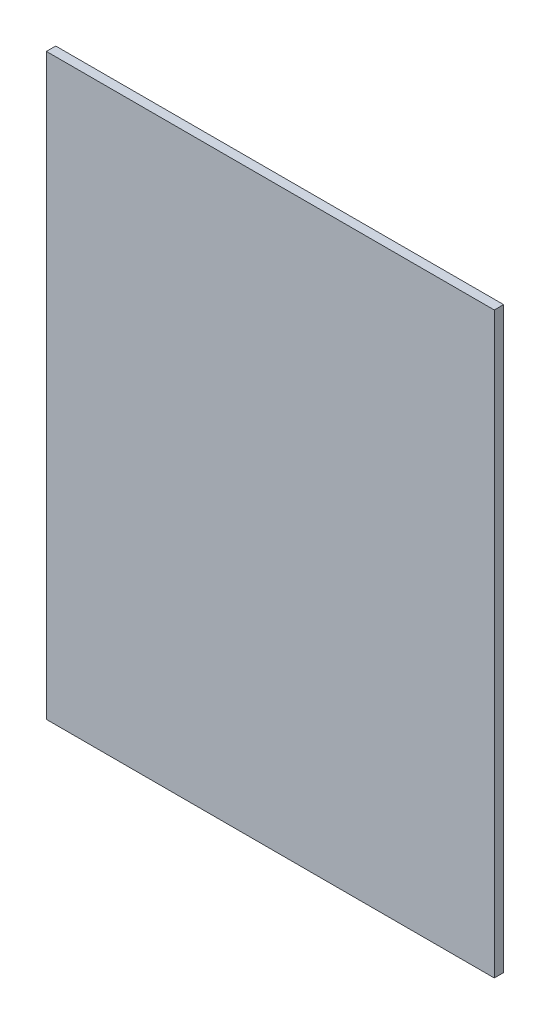
ISO-10303-21;
HEADER;
FILE_DESCRIPTION(('STEP AP214'),'2;1');
FILE_NAME('part.step','',(''),(''),'','','');
FILE_SCHEMA(('AUTOMOTIVE_DESIGN { 1 0 10303 214 1 1 1 1 }'));
ENDSEC;
DATA;
#1=APPLICATION_CONTEXT('core data for automotive mechanical design processes');
#2=APPLICATION_PROTOCOL_DEFINITION('international standard','automotive_design',2000,#1);
#3=PRODUCT_CONTEXT('',#1,'mechanical');
#4=PRODUCT('Part','Part','',(#3));
#5=PRODUCT_RELATED_PRODUCT_CATEGORY('part','',(#4));
#6=PRODUCT_DEFINITION_FORMATION('','',#4);
#7=PRODUCT_DEFINITION_CONTEXT('part definition',#1,'design');
#8=PRODUCT_DEFINITION('design','',#6,#7);
#9=PRODUCT_DEFINITION_SHAPE('','',#8);
#10=(LENGTH_UNIT() NAMED_UNIT(*) SI_UNIT(.MILLI.,.METRE.));
#11=(NAMED_UNIT(*) PLANE_ANGLE_UNIT() SI_UNIT($,.RADIAN.));
#12=(NAMED_UNIT(*) SI_UNIT($,.STERADIAN.) SOLID_ANGLE_UNIT());
#13=UNCERTAINTY_MEASURE_WITH_UNIT(LENGTH_MEASURE(1.E-05),#10,'distance_accuracy_value','');
#14=(GEOMETRIC_REPRESENTATION_CONTEXT(3) GLOBAL_UNCERTAINTY_ASSIGNED_CONTEXT((#13)) GLOBAL_UNIT_ASSIGNED_CONTEXT((#10,
#11,#12)) REPRESENTATION_CONTEXT('',''));
#15=CARTESIAN_POINT('',(0.,0.,0.));
#16=DIRECTION('',(0.,0.,1.));
#17=DIRECTION('',(1.,0.,0.));
#18=AXIS2_PLACEMENT_3D('',#15,#16,#17);
#19=CARTESIAN_POINT('',(120.,-155.,5.));
#20=DIRECTION('',(-1.,0.,0.));
#21=DIRECTION('',(0.,0.,1.));
#22=AXIS2_PLACEMENT_3D('',#19,#20,#21);
#23=PLANE('',#22);
#24=DIRECTION('',(0.,1.,0.));
#25=VECTOR('',#24,1.);
#26=CARTESIAN_POINT('',(120.,-155.,0.));
#27=LINE('',#26,#25);
#28=CARTESIAN_POINT('',(120.,-155.,0.));
#29=VERTEX_POINT('',#28);
#30=CARTESIAN_POINT('',(120.,155.,0.));
#31=VERTEX_POINT('',#30);
#32=EDGE_CURVE('E96',#29,#31,#27,.T.);
#33=ORIENTED_EDGE('',*,*,#32,.T.);
#34=DIRECTION('',(0.,0.,-1.));
#35=VECTOR('',#34,1.);
#36=CARTESIAN_POINT('',(120.,155.,5.));
#37=LINE('',#36,#35);
#38=CARTESIAN_POINT('',(120.,155.,5.));
#39=VERTEX_POINT('',#38);
#40=EDGE_CURVE('E11',#39,#31,#37,.T.);
#41=ORIENTED_EDGE('',*,*,#40,.F.);
#42=DIRECTION('',(0.,1.,0.));
#43=VECTOR('',#42,1.);
#44=CARTESIAN_POINT('',(120.,-155.,5.));
#45=LINE('',#44,#43);
#46=CARTESIAN_POINT('',(120.,-155.,5.));
#47=VERTEX_POINT('',#46);
#48=EDGE_CURVE('E84',#47,#39,#45,.T.);
#49=ORIENTED_EDGE('',*,*,#48,.F.);
#50=DIRECTION('',(0.,0.,-1.));
#51=VECTOR('',#50,1.);
#52=CARTESIAN_POINT('',(120.,-155.,5.));
#53=LINE('',#52,#51);
#54=EDGE_CURVE('E92',#47,#29,#53,.T.);
#55=ORIENTED_EDGE('',*,*,#54,.T.);
#56=EDGE_LOOP('',(#33,#41,#49,#55));
#57=FACE_BOUND('',#56,.T.);
#58=ADVANCED_FACE('F33',(#57),#23,.F.);
#59=CARTESIAN_POINT('',(-120.,155.,5.));
#60=DIRECTION('',(0.,-1.,0.));
#61=DIRECTION('',(0.,0.,-1.));
#62=AXIS2_PLACEMENT_3D('',#59,#60,#61);
#63=PLANE('',#62);
#64=DIRECTION('',(-1.,0.,0.));
#65=VECTOR('',#64,1.);
#66=CARTESIAN_POINT('',(-120.,155.,0.));
#67=LINE('',#66,#65);
#68=CARTESIAN_POINT('',(-120.,155.,0.));
#69=VERTEX_POINT('',#68);
#70=EDGE_CURVE('E88',#31,#69,#67,.T.);
#71=ORIENTED_EDGE('',*,*,#70,.T.);
#72=DIRECTION('',(0.,0.,-1.));
#73=VECTOR('',#72,1.);
#74=CARTESIAN_POINT('',(-120.,155.,5.));
#75=LINE('',#74,#73);
#76=CARTESIAN_POINT('',(-120.,155.,5.));
#77=VERTEX_POINT('',#76);
#78=EDGE_CURVE('E41',#77,#69,#75,.T.);
#79=ORIENTED_EDGE('',*,*,#78,.F.);
#80=DIRECTION('',(-1.,0.,0.));
#81=VECTOR('',#80,1.);
#82=CARTESIAN_POINT('',(-120.,155.,5.));
#83=LINE('',#82,#81);
#84=EDGE_CURVE('E79',#39,#77,#83,.T.);
#85=ORIENTED_EDGE('',*,*,#84,.F.);
#86=ORIENTED_EDGE('',*,*,#40,.T.);
#87=EDGE_LOOP('',(#71,#79,#85,#86));
#88=FACE_BOUND('',#87,.T.);
#89=ADVANCED_FACE('F87',(#88),#63,.F.);
#90=CARTESIAN_POINT('',(-120.,-155.,5.));
#91=DIRECTION('',(1.,0.,0.));
#92=DIRECTION('',(0.,0.,-1.));
#93=AXIS2_PLACEMENT_3D('',#90,#91,#92);
#94=PLANE('',#93);
#95=DIRECTION('',(0.,-1.,0.));
#96=VECTOR('',#95,1.);
#97=CARTESIAN_POINT('',(-120.,-155.,0.));
#98=LINE('',#97,#96);
#99=CARTESIAN_POINT('',(-120.,-155.,0.));
#100=VERTEX_POINT('',#99);
#101=EDGE_CURVE('E66',#69,#100,#98,.T.);
#102=ORIENTED_EDGE('',*,*,#101,.T.);
#103=DIRECTION('',(0.,0.,-1.));
#104=VECTOR('',#103,1.);
#105=CARTESIAN_POINT('',(-120.,-155.,5.));
#106=LINE('',#105,#104);
#107=CARTESIAN_POINT('',(-120.,-155.,5.));
#108=VERTEX_POINT('',#107);
#109=EDGE_CURVE('E89',#108,#100,#106,.T.);
#110=ORIENTED_EDGE('',*,*,#109,.F.);
#111=DIRECTION('',(0.,-1.,0.));
#112=VECTOR('',#111,1.);
#113=CARTESIAN_POINT('',(-120.,-155.,5.));
#114=LINE('',#113,#112);
#115=EDGE_CURVE('E82',#77,#108,#114,.T.);
#116=ORIENTED_EDGE('',*,*,#115,.F.);
#117=ORIENTED_EDGE('',*,*,#78,.T.);
#118=EDGE_LOOP('',(#102,#110,#116,#117));
#119=FACE_BOUND('',#118,.T.);
#120=ADVANCED_FACE('F90',(#119),#94,.F.);
#121=CARTESIAN_POINT('',(-120.,-155.,5.));
#122=DIRECTION('',(0.,1.,0.));
#123=DIRECTION('',(0.,0.,1.));
#124=AXIS2_PLACEMENT_3D('',#121,#122,#123);
#125=PLANE('',#124);
#126=DIRECTION('',(1.,0.,0.));
#127=VECTOR('',#126,1.);
#128=CARTESIAN_POINT('',(-120.,-155.,0.));
#129=LINE('',#128,#127);
#130=EDGE_CURVE('E72',#100,#29,#129,.T.);
#131=ORIENTED_EDGE('',*,*,#130,.T.);
#132=ORIENTED_EDGE('',*,*,#54,.F.);
#133=DIRECTION('',(1.,0.,0.));
#134=VECTOR('',#133,1.);
#135=CARTESIAN_POINT('',(-120.,-155.,5.));
#136=LINE('',#135,#134);
#137=EDGE_CURVE('E49',#108,#47,#136,.T.);
#138=ORIENTED_EDGE('',*,*,#137,.F.);
#139=ORIENTED_EDGE('',*,*,#109,.T.);
#140=EDGE_LOOP('',(#131,#132,#138,#139));
#141=FACE_BOUND('',#140,.T.);
#142=ADVANCED_FACE('F103',(#141),#125,.F.);
#143=CARTESIAN_POINT('',(0.,0.,5.));
#144=DIRECTION('',(0.,0.,-1.));
#145=DIRECTION('',(-1.,0.,0.));
#146=AXIS2_PLACEMENT_3D('',#143,#144,#145);
#147=PLANE('',#146);
#148=ORIENTED_EDGE('',*,*,#48,.T.);
#149=ORIENTED_EDGE('',*,*,#84,.T.);
#150=ORIENTED_EDGE('',*,*,#115,.T.);
#151=ORIENTED_EDGE('',*,*,#137,.T.);
#152=EDGE_LOOP('',(#148,#149,#150,#151));
#153=FACE_BOUND('',#152,.T.);
#154=ADVANCED_FACE('F80',(#153),#147,.F.);
#155=CARTESIAN_POINT('',(0.,0.,0.));
#156=DIRECTION('',(0.,0.,-1.));
#157=DIRECTION('',(-1.,0.,0.));
#158=AXIS2_PLACEMENT_3D('',#155,#156,#157);
#159=PLANE('',#158);
#160=ORIENTED_EDGE('',*,*,#32,.F.);
#161=ORIENTED_EDGE('',*,*,#130,.F.);
#162=ORIENTED_EDGE('',*,*,#101,.F.);
#163=ORIENTED_EDGE('',*,*,#70,.F.);
#164=EDGE_LOOP('',(#160,#161,#162,#163));
#165=FACE_BOUND('',#164,.T.);
#166=ADVANCED_FACE('F106',(#165),#159,.T.);
#167=CLOSED_SHELL('',(#58,#89,#120,#142,#154,#166));
#168=MANIFOLD_SOLID_BREP('B2',#167);
#169=ADVANCED_BREP_SHAPE_REPRESENTATION('',(#18,#168),#14);
#170=SHAPE_DEFINITION_REPRESENTATION(#9,#169);
ENDSEC;
END-ISO-10303-21;
